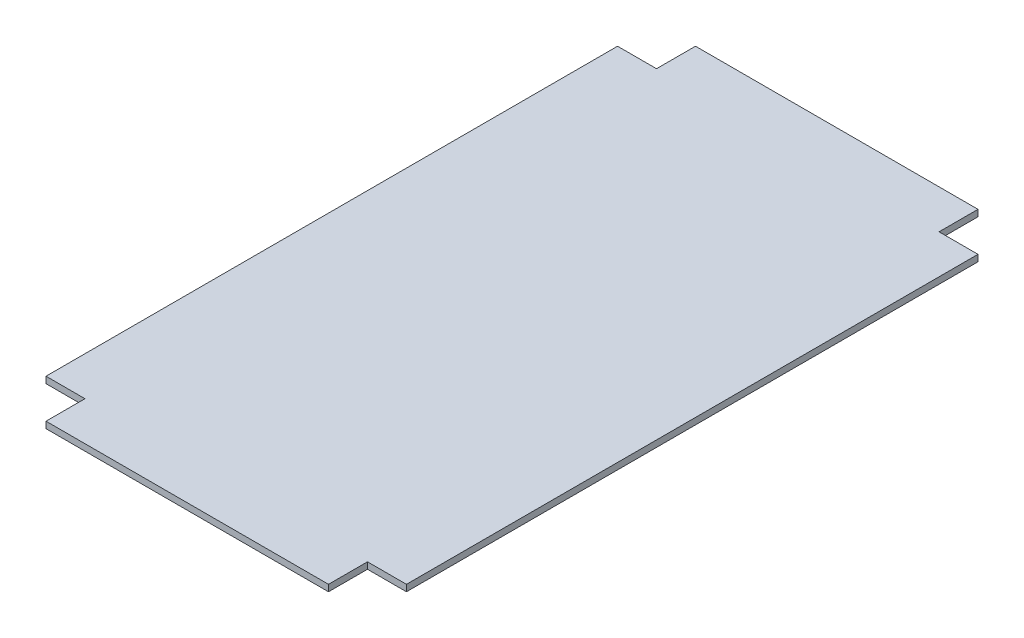
ISO-10303-21;
HEADER;
FILE_DESCRIPTION(('STEP AP214'),'2;1');
FILE_NAME('part.step','',(''),(''),'','','');
FILE_SCHEMA(('AUTOMOTIVE_DESIGN { 1 0 10303 214 1 1 1 1 }'));
ENDSEC;
DATA;
#1=APPLICATION_CONTEXT('core data for automotive mechanical design processes');
#2=APPLICATION_PROTOCOL_DEFINITION('international standard','automotive_design',2000,#1);
#3=PRODUCT_CONTEXT('',#1,'mechanical');
#4=PRODUCT('Part','Part','',(#3));
#5=PRODUCT_RELATED_PRODUCT_CATEGORY('part','',(#4));
#6=PRODUCT_DEFINITION_FORMATION('','',#4);
#7=PRODUCT_DEFINITION_CONTEXT('part definition',#1,'design');
#8=PRODUCT_DEFINITION('design','',#6,#7);
#9=PRODUCT_DEFINITION_SHAPE('','',#8);
#10=(LENGTH_UNIT() NAMED_UNIT(*) SI_UNIT(.MILLI.,.METRE.));
#11=(NAMED_UNIT(*) PLANE_ANGLE_UNIT() SI_UNIT($,.RADIAN.));
#12=(NAMED_UNIT(*) SI_UNIT($,.STERADIAN.) SOLID_ANGLE_UNIT());
#13=UNCERTAINTY_MEASURE_WITH_UNIT(LENGTH_MEASURE(1.E-05),#10,'distance_accuracy_value','');
#14=(GEOMETRIC_REPRESENTATION_CONTEXT(3) GLOBAL_UNCERTAINTY_ASSIGNED_CONTEXT((#13)) GLOBAL_UNIT_ASSIGNED_CONTEXT((#10,
#11,#12)) REPRESENTATION_CONTEXT('',''));
#15=CARTESIAN_POINT('',(0.,0.,0.));
#16=DIRECTION('',(0.,0.,1.));
#17=DIRECTION('',(1.,0.,0.));
#18=AXIS2_PLACEMENT_3D('',#15,#16,#17);
#19=CARTESIAN_POINT('',(138.74,5.,220.));
#20=DIRECTION('',(0.,0.,-1.));
#21=DIRECTION('',(-1.,0.,0.));
#22=AXIS2_PLACEMENT_3D('',#19,#20,#21);
#23=PLANE('',#22);
#24=DIRECTION('',(0.,1.,0.));
#25=VECTOR('',#24,1.);
#26=CARTESIAN_POINT('',(108.74,0.,220.));
#27=LINE('',#26,#25);
#28=CARTESIAN_POINT('',(108.74,0.,220.));
#29=VERTEX_POINT('',#28);
#30=CARTESIAN_POINT('',(108.74,5.,220.));
#31=VERTEX_POINT('',#30);
#32=EDGE_CURVE('E133',#29,#31,#27,.T.);
#33=ORIENTED_EDGE('',*,*,#32,.F.);
#34=DIRECTION('',(1.,0.,0.));
#35=VECTOR('',#34,1.);
#36=CARTESIAN_POINT('',(138.74,0.,220.));
#37=LINE('',#36,#35);
#38=CARTESIAN_POINT('',(138.74,0.,220.));
#39=VERTEX_POINT('',#38);
#40=EDGE_CURVE('E182',#29,#39,#37,.T.);
#41=ORIENTED_EDGE('',*,*,#40,.T.);
#42=DIRECTION('',(0.,-1.,0.));
#43=VECTOR('',#42,1.);
#44=CARTESIAN_POINT('',(138.74,5.,220.));
#45=LINE('',#44,#43);
#46=CARTESIAN_POINT('',(138.74,5.,220.));
#47=VERTEX_POINT('',#46);
#48=EDGE_CURVE('E52',#47,#39,#45,.T.);
#49=ORIENTED_EDGE('',*,*,#48,.F.);
#50=DIRECTION('',(1.,0.,0.));
#51=VECTOR('',#50,1.);
#52=CARTESIAN_POINT('',(138.74,5.,220.));
#53=LINE('',#52,#51);
#54=EDGE_CURVE('E149',#31,#47,#53,.T.);
#55=ORIENTED_EDGE('',*,*,#54,.F.);
#56=EDGE_LOOP('',(#33,#41,#49,#55));
#57=FACE_BOUND('',#56,.T.);
#58=ADVANCED_FACE('F43',(#57),#23,.F.);
#59=CARTESIAN_POINT('',(138.74,5.,-220.));
#60=DIRECTION('',(0.,0.,1.));
#61=DIRECTION('',(1.,0.,0.));
#62=AXIS2_PLACEMENT_3D('',#59,#60,#61);
#63=PLANE('',#62);
#64=DIRECTION('',(0.,1.,0.));
#65=VECTOR('',#64,1.);
#66=CARTESIAN_POINT('',(-108.74,0.,-220.));
#67=LINE('',#66,#65);
#68=CARTESIAN_POINT('',(-108.74,0.,-220.));
#69=VERTEX_POINT('',#68);
#70=CARTESIAN_POINT('',(-108.74,5.,-220.));
#71=VERTEX_POINT('',#70);
#72=EDGE_CURVE('E242',#69,#71,#67,.T.);
#73=ORIENTED_EDGE('',*,*,#72,.F.);
#74=DIRECTION('',(-1.,0.,0.));
#75=VECTOR('',#74,1.);
#76=CARTESIAN_POINT('',(138.74,0.,-220.));
#77=LINE('',#76,#75);
#78=CARTESIAN_POINT('',(-138.74,0.,-220.));
#79=VERTEX_POINT('',#78);
#80=EDGE_CURVE('E191',#69,#79,#77,.T.);
#81=ORIENTED_EDGE('',*,*,#80,.T.);
#82=DIRECTION('',(0.,-1.,0.));
#83=VECTOR('',#82,1.);
#84=CARTESIAN_POINT('',(-138.74,5.,-220.));
#85=LINE('',#84,#83);
#86=CARTESIAN_POINT('',(-138.74,5.,-220.));
#87=VERTEX_POINT('',#86);
#88=EDGE_CURVE('E177',#87,#79,#85,.T.);
#89=ORIENTED_EDGE('',*,*,#88,.F.);
#90=DIRECTION('',(-1.,0.,0.));
#91=VECTOR('',#90,1.);
#92=CARTESIAN_POINT('',(138.74,5.,-220.));
#93=LINE('',#92,#91);
#94=EDGE_CURVE('E172',#71,#87,#93,.T.);
#95=ORIENTED_EDGE('',*,*,#94,.F.);
#96=EDGE_LOOP('',(#73,#81,#89,#95));
#97=FACE_BOUND('',#96,.T.);
#98=ADVANCED_FACE('F282',(#97),#63,.F.);
#99=CARTESIAN_POINT('',(-138.74,5.,220.));
#100=DIRECTION('',(1.,0.,0.));
#101=DIRECTION('',(0.,0.,-1.));
#102=AXIS2_PLACEMENT_3D('',#99,#100,#101);
#103=PLANE('',#102);
#104=DIRECTION('',(0.,0.,1.));
#105=VECTOR('',#104,1.);
#106=CARTESIAN_POINT('',(-138.74,0.,220.));
#107=LINE('',#106,#105);
#108=CARTESIAN_POINT('',(-138.74,0.,220.));
#109=VERTEX_POINT('',#108);
#110=EDGE_CURVE('E178',#79,#109,#107,.T.);
#111=ORIENTED_EDGE('',*,*,#110,.T.);
#112=DIRECTION('',(0.,-1.,0.));
#113=VECTOR('',#112,1.);
#114=CARTESIAN_POINT('',(-138.74,5.,220.));
#115=LINE('',#114,#113);
#116=CARTESIAN_POINT('',(-138.74,5.,220.));
#117=VERTEX_POINT('',#116);
#118=EDGE_CURVE('E11',#117,#109,#115,.T.);
#119=ORIENTED_EDGE('',*,*,#118,.F.);
#120=DIRECTION('',(0.,0.,1.));
#121=VECTOR('',#120,1.);
#122=CARTESIAN_POINT('',(-138.74,5.,220.));
#123=LINE('',#122,#121);
#124=EDGE_CURVE('E160',#87,#117,#123,.T.);
#125=ORIENTED_EDGE('',*,*,#124,.F.);
#126=ORIENTED_EDGE('',*,*,#88,.T.);
#127=EDGE_LOOP('',(#111,#119,#125,#126));
#128=FACE_BOUND('',#127,.T.);
#129=ADVANCED_FACE('F45',(#128),#103,.F.);
#130=CARTESIAN_POINT('',(-108.74,0.,220.));
#131=VERTEX_POINT('',#130);
#132=EDGE_CURVE('E184',#109,#131,#37,.T.);
#133=ORIENTED_EDGE('',*,*,#132,.T.);
#134=DIRECTION('',(0.,1.,0.));
#135=VECTOR('',#134,1.);
#136=CARTESIAN_POINT('',(-108.74,0.,220.));
#137=LINE('',#136,#135);
#138=CARTESIAN_POINT('',(-108.74,5.,220.));
#139=VERTEX_POINT('',#138);
#140=EDGE_CURVE('E261',#131,#139,#137,.T.);
#141=ORIENTED_EDGE('',*,*,#140,.T.);
#142=EDGE_CURVE('E159',#117,#139,#53,.T.);
#143=ORIENTED_EDGE('',*,*,#142,.F.);
#144=ORIENTED_EDGE('',*,*,#118,.T.);
#145=EDGE_LOOP('',(#133,#141,#143,#144));
#146=FACE_BOUND('',#145,.T.);
#147=ADVANCED_FACE('F272',(#146),#23,.F.);
#148=CARTESIAN_POINT('',(138.74,5.,220.));
#149=DIRECTION('',(-1.,0.,0.));
#150=DIRECTION('',(0.,0.,1.));
#151=AXIS2_PLACEMENT_3D('',#148,#149,#150);
#152=PLANE('',#151);
#153=DIRECTION('',(0.,0.,-1.));
#154=VECTOR('',#153,1.);
#155=CARTESIAN_POINT('',(138.74,0.,220.));
#156=LINE('',#155,#154);
#157=CARTESIAN_POINT('',(138.74,0.,-220.));
#158=VERTEX_POINT('',#157);
#159=EDGE_CURVE('E188',#39,#158,#156,.T.);
#160=ORIENTED_EDGE('',*,*,#159,.T.);
#161=DIRECTION('',(0.,-1.,0.));
#162=VECTOR('',#161,1.);
#163=CARTESIAN_POINT('',(138.74,5.,-220.));
#164=LINE('',#163,#162);
#165=CARTESIAN_POINT('',(138.74,5.,-220.));
#166=VERTEX_POINT('',#165);
#167=EDGE_CURVE('E198',#166,#158,#164,.T.);
#168=ORIENTED_EDGE('',*,*,#167,.F.);
#169=DIRECTION('',(0.,0.,-1.));
#170=VECTOR('',#169,1.);
#171=CARTESIAN_POINT('',(138.74,5.,220.));
#172=LINE('',#171,#170);
#173=EDGE_CURVE('E165',#47,#166,#172,.T.);
#174=ORIENTED_EDGE('',*,*,#173,.F.);
#175=ORIENTED_EDGE('',*,*,#48,.T.);
#176=EDGE_LOOP('',(#160,#168,#174,#175));
#177=FACE_BOUND('',#176,.T.);
#178=ADVANCED_FACE('F204',(#177),#152,.F.);
#179=CARTESIAN_POINT('',(108.74,0.,-220.));
#180=VERTEX_POINT('',#179);
#181=EDGE_CURVE('E166',#158,#180,#77,.T.);
#182=ORIENTED_EDGE('',*,*,#181,.T.);
#183=DIRECTION('',(0.,1.,0.));
#184=VECTOR('',#183,1.);
#185=CARTESIAN_POINT('',(108.74,0.,-220.));
#186=LINE('',#185,#184);
#187=CARTESIAN_POINT('',(108.74,5.,-220.));
#188=VERTEX_POINT('',#187);
#189=EDGE_CURVE('E217',#180,#188,#186,.T.);
#190=ORIENTED_EDGE('',*,*,#189,.T.);
#191=EDGE_CURVE('E173',#166,#188,#93,.T.);
#192=ORIENTED_EDGE('',*,*,#191,.F.);
#193=ORIENTED_EDGE('',*,*,#167,.T.);
#194=EDGE_LOOP('',(#182,#190,#192,#193));
#195=FACE_BOUND('',#194,.T.);
#196=ADVANCED_FACE('F215',(#195),#63,.F.);
#197=CARTESIAN_POINT('',(0.,5.,0.));
#198=DIRECTION('',(0.,1.,0.));
#199=DIRECTION('',(0.,0.,1.));
#200=AXIS2_PLACEMENT_3D('',#197,#198,#199);
#201=PLANE('',#200);
#202=ORIENTED_EDGE('',*,*,#124,.T.);
#203=ORIENTED_EDGE('',*,*,#142,.T.);
#204=DIRECTION('',(0.,0.,1.));
#205=VECTOR('',#204,1.);
#206=CARTESIAN_POINT('',(-108.74,5.,220.));
#207=LINE('',#206,#205);
#208=CARTESIAN_POINT('',(-108.74,5.,250.));
#209=VERTEX_POINT('',#208);
#210=EDGE_CURVE('E59',#139,#209,#207,.T.);
#211=ORIENTED_EDGE('',*,*,#210,.T.);
#212=DIRECTION('',(1.,0.,0.));
#213=VECTOR('',#212,1.);
#214=CARTESIAN_POINT('',(-108.74,5.,250.));
#215=LINE('',#214,#213);
#216=CARTESIAN_POINT('',(108.74,5.,250.));
#217=VERTEX_POINT('',#216);
#218=EDGE_CURVE('E152',#209,#217,#215,.T.);
#219=ORIENTED_EDGE('',*,*,#218,.T.);
#220=DIRECTION('',(0.,0.,-1.));
#221=VECTOR('',#220,1.);
#222=CARTESIAN_POINT('',(108.74,5.,220.));
#223=LINE('',#222,#221);
#224=EDGE_CURVE('E136',#217,#31,#223,.T.);
#225=ORIENTED_EDGE('',*,*,#224,.T.);
#226=ORIENTED_EDGE('',*,*,#54,.T.);
#227=ORIENTED_EDGE('',*,*,#173,.T.);
#228=ORIENTED_EDGE('',*,*,#191,.T.);
#229=DIRECTION('',(0.,0.,-1.));
#230=VECTOR('',#229,1.);
#231=CARTESIAN_POINT('',(108.74,5.,-220.));
#232=LINE('',#231,#230);
#233=CARTESIAN_POINT('',(108.74,5.,-250.));
#234=VERTEX_POINT('',#233);
#235=EDGE_CURVE('E67',#188,#234,#232,.T.);
#236=ORIENTED_EDGE('',*,*,#235,.T.);
#237=DIRECTION('',(-1.,0.,0.));
#238=VECTOR('',#237,1.);
#239=CARTESIAN_POINT('',(-108.74,5.,-250.));
#240=LINE('',#239,#238);
#241=CARTESIAN_POINT('',(-108.74,5.,-250.));
#242=VERTEX_POINT('',#241);
#243=EDGE_CURVE('E221',#234,#242,#240,.T.);
#244=ORIENTED_EDGE('',*,*,#243,.T.);
#245=DIRECTION('',(0.,0.,1.));
#246=VECTOR('',#245,1.);
#247=CARTESIAN_POINT('',(-108.74,5.,-220.));
#248=LINE('',#247,#246);
#249=EDGE_CURVE('E223',#242,#71,#248,.T.);
#250=ORIENTED_EDGE('',*,*,#249,.T.);
#251=ORIENTED_EDGE('',*,*,#94,.T.);
#252=EDGE_LOOP('',(#202,#203,#211,#219,#225,#226,#227,#228,#236,#244,#250,#251));
#253=FACE_BOUND('',#252,.T.);
#254=ADVANCED_FACE('F148',(#253),#201,.T.);
#255=CARTESIAN_POINT('',(0.,0.,0.));
#256=DIRECTION('',(0.,1.,0.));
#257=DIRECTION('',(0.,0.,1.));
#258=AXIS2_PLACEMENT_3D('',#255,#256,#257);
#259=PLANE('',#258);
#260=ORIENTED_EDGE('',*,*,#110,.F.);
#261=ORIENTED_EDGE('',*,*,#80,.F.);
#262=DIRECTION('',(0.,0.,1.));
#263=VECTOR('',#262,1.);
#264=CARTESIAN_POINT('',(-108.74,0.,-220.));
#265=LINE('',#264,#263);
#266=CARTESIAN_POINT('',(-108.74,0.,-250.));
#267=VERTEX_POINT('',#266);
#268=EDGE_CURVE('E231',#267,#69,#265,.T.);
#269=ORIENTED_EDGE('',*,*,#268,.F.);
#270=DIRECTION('',(-1.,0.,0.));
#271=VECTOR('',#270,1.);
#272=CARTESIAN_POINT('',(-108.74,0.,-250.));
#273=LINE('',#272,#271);
#274=CARTESIAN_POINT('',(108.74,0.,-250.));
#275=VERTEX_POINT('',#274);
#276=EDGE_CURVE('E244',#275,#267,#273,.T.);
#277=ORIENTED_EDGE('',*,*,#276,.F.);
#278=DIRECTION('',(0.,0.,-1.));
#279=VECTOR('',#278,1.);
#280=CARTESIAN_POINT('',(108.74,0.,-220.));
#281=LINE('',#280,#279);
#282=EDGE_CURVE('E213',#180,#275,#281,.T.);
#283=ORIENTED_EDGE('',*,*,#282,.F.);
#284=ORIENTED_EDGE('',*,*,#181,.F.);
#285=ORIENTED_EDGE('',*,*,#159,.F.);
#286=ORIENTED_EDGE('',*,*,#40,.F.);
#287=DIRECTION('',(0.,0.,-1.));
#288=VECTOR('',#287,1.);
#289=CARTESIAN_POINT('',(108.74,0.,220.));
#290=LINE('',#289,#288);
#291=CARTESIAN_POINT('',(108.74,0.,250.));
#292=VERTEX_POINT('',#291);
#293=EDGE_CURVE('E138',#292,#29,#290,.T.);
#294=ORIENTED_EDGE('',*,*,#293,.F.);
#295=DIRECTION('',(1.,0.,0.));
#296=VECTOR('',#295,1.);
#297=CARTESIAN_POINT('',(-108.74,0.,250.));
#298=LINE('',#297,#296);
#299=CARTESIAN_POINT('',(-108.74,0.,250.));
#300=VERTEX_POINT('',#299);
#301=EDGE_CURVE('E260',#300,#292,#298,.T.);
#302=ORIENTED_EDGE('',*,*,#301,.F.);
#303=DIRECTION('',(0.,0.,1.));
#304=VECTOR('',#303,1.);
#305=CARTESIAN_POINT('',(-108.74,0.,220.));
#306=LINE('',#305,#304);
#307=EDGE_CURVE('E154',#131,#300,#306,.T.);
#308=ORIENTED_EDGE('',*,*,#307,.F.);
#309=ORIENTED_EDGE('',*,*,#132,.F.);
#310=EDGE_LOOP('',(#260,#261,#269,#277,#283,#284,#285,#286,#294,#302,#308,#309));
#311=FACE_BOUND('',#310,.T.);
#312=ADVANCED_FACE('F209',(#311),#259,.F.);
#313=CARTESIAN_POINT('',(-108.74,0.,-220.));
#314=DIRECTION('',(-1.,0.,0.));
#315=DIRECTION('',(0.,0.,1.));
#316=AXIS2_PLACEMENT_3D('',#313,#314,#315);
#317=PLANE('',#316);
#318=ORIENTED_EDGE('',*,*,#249,.F.);
#319=DIRECTION('',(0.,1.,0.));
#320=VECTOR('',#319,1.);
#321=CARTESIAN_POINT('',(-108.74,0.,-250.));
#322=LINE('',#321,#320);
#323=EDGE_CURVE('E183',#267,#242,#322,.T.);
#324=ORIENTED_EDGE('',*,*,#323,.F.);
#325=ORIENTED_EDGE('',*,*,#268,.T.);
#326=ORIENTED_EDGE('',*,*,#72,.T.);
#327=EDGE_LOOP('',(#318,#324,#325,#326));
#328=FACE_BOUND('',#327,.T.);
#329=ADVANCED_FACE('F339',(#328),#317,.T.);
#330=CARTESIAN_POINT('',(-108.74,0.,-250.));
#331=DIRECTION('',(0.,0.,-1.));
#332=DIRECTION('',(-1.,0.,0.));
#333=AXIS2_PLACEMENT_3D('',#330,#331,#332);
#334=PLANE('',#333);
#335=ORIENTED_EDGE('',*,*,#243,.F.);
#336=DIRECTION('',(0.,1.,0.));
#337=VECTOR('',#336,1.);
#338=CARTESIAN_POINT('',(108.74,0.,-250.));
#339=LINE('',#338,#337);
#340=EDGE_CURVE('E228',#275,#234,#339,.T.);
#341=ORIENTED_EDGE('',*,*,#340,.F.);
#342=ORIENTED_EDGE('',*,*,#276,.T.);
#343=ORIENTED_EDGE('',*,*,#323,.T.);
#344=EDGE_LOOP('',(#335,#341,#342,#343));
#345=FACE_BOUND('',#344,.T.);
#346=ADVANCED_FACE('F226',(#345),#334,.T.);
#347=CARTESIAN_POINT('',(108.74,0.,-220.));
#348=DIRECTION('',(1.,0.,0.));
#349=DIRECTION('',(0.,0.,-1.));
#350=AXIS2_PLACEMENT_3D('',#347,#348,#349);
#351=PLANE('',#350);
#352=ORIENTED_EDGE('',*,*,#235,.F.);
#353=ORIENTED_EDGE('',*,*,#189,.F.);
#354=ORIENTED_EDGE('',*,*,#282,.T.);
#355=ORIENTED_EDGE('',*,*,#340,.T.);
#356=EDGE_LOOP('',(#352,#353,#354,#355));
#357=FACE_BOUND('',#356,.T.);
#358=ADVANCED_FACE('F351',(#357),#351,.T.);
#359=CARTESIAN_POINT('',(108.74,0.,220.));
#360=DIRECTION('',(1.,0.,0.));
#361=DIRECTION('',(0.,0.,-1.));
#362=AXIS2_PLACEMENT_3D('',#359,#360,#361);
#363=PLANE('',#362);
#364=ORIENTED_EDGE('',*,*,#224,.F.);
#365=DIRECTION('',(0.,1.,0.));
#366=VECTOR('',#365,1.);
#367=CARTESIAN_POINT('',(108.74,0.,250.));
#368=LINE('',#367,#366);
#369=EDGE_CURVE('E143',#292,#217,#368,.T.);
#370=ORIENTED_EDGE('',*,*,#369,.F.);
#371=ORIENTED_EDGE('',*,*,#293,.T.);
#372=ORIENTED_EDGE('',*,*,#32,.T.);
#373=EDGE_LOOP('',(#364,#370,#371,#372));
#374=FACE_BOUND('',#373,.T.);
#375=ADVANCED_FACE('F135',(#374),#363,.T.);
#376=CARTESIAN_POINT('',(-108.74,0.,250.));
#377=DIRECTION('',(0.,0.,1.));
#378=DIRECTION('',(1.,0.,0.));
#379=AXIS2_PLACEMENT_3D('',#376,#377,#378);
#380=PLANE('',#379);
#381=ORIENTED_EDGE('',*,*,#218,.F.);
#382=DIRECTION('',(0.,1.,0.));
#383=VECTOR('',#382,1.);
#384=CARTESIAN_POINT('',(-108.74,0.,250.));
#385=LINE('',#384,#383);
#386=EDGE_CURVE('E269',#300,#209,#385,.T.);
#387=ORIENTED_EDGE('',*,*,#386,.F.);
#388=ORIENTED_EDGE('',*,*,#301,.T.);
#389=ORIENTED_EDGE('',*,*,#369,.T.);
#390=EDGE_LOOP('',(#381,#387,#388,#389));
#391=FACE_BOUND('',#390,.T.);
#392=ADVANCED_FACE('F364',(#391),#380,.T.);
#393=CARTESIAN_POINT('',(-108.74,0.,220.));
#394=DIRECTION('',(-1.,0.,0.));
#395=DIRECTION('',(0.,0.,1.));
#396=AXIS2_PLACEMENT_3D('',#393,#394,#395);
#397=PLANE('',#396);
#398=ORIENTED_EDGE('',*,*,#210,.F.);
#399=ORIENTED_EDGE('',*,*,#140,.F.);
#400=ORIENTED_EDGE('',*,*,#307,.T.);
#401=ORIENTED_EDGE('',*,*,#386,.T.);
#402=EDGE_LOOP('',(#398,#399,#400,#401));
#403=FACE_BOUND('',#402,.T.);
#404=ADVANCED_FACE('F268',(#403),#397,.T.);
#405=CLOSED_SHELL('',(#58,#98,#129,#147,#178,#196,#254,#312,#329,#346,#358,#375,#392,#404));
#406=MANIFOLD_SOLID_BREP('B2',#405);
#407=ADVANCED_BREP_SHAPE_REPRESENTATION('',(#18,#406),#14);
#408=SHAPE_DEFINITION_REPRESENTATION(#9,#407);
ENDSEC;
END-ISO-10303-21;
